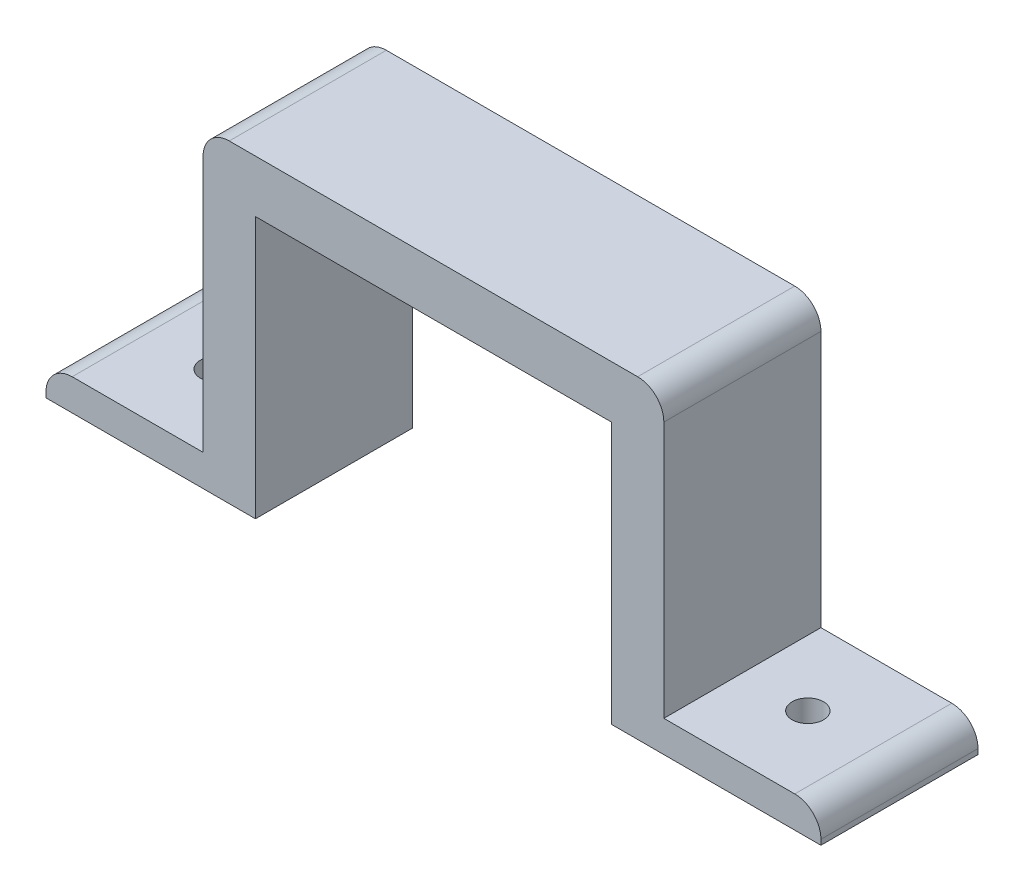
ISO-10303-21;
HEADER;
FILE_DESCRIPTION(('STEP AP214'),'2;1');
FILE_NAME('part.step','',(''),(''),'','','');
FILE_SCHEMA(('AUTOMOTIVE_DESIGN { 1 0 10303 214 1 1 1 1 }'));
ENDSEC;
DATA;
#1=APPLICATION_CONTEXT('core data for automotive mechanical design processes');
#2=APPLICATION_PROTOCOL_DEFINITION('international standard','automotive_design',2000,#1);
#3=PRODUCT_CONTEXT('',#1,'mechanical');
#4=PRODUCT('Part','Part','',(#3));
#5=PRODUCT_RELATED_PRODUCT_CATEGORY('part','',(#4));
#6=PRODUCT_DEFINITION_FORMATION('','',#4);
#7=PRODUCT_DEFINITION_CONTEXT('part definition',#1,'design');
#8=PRODUCT_DEFINITION('design','',#6,#7);
#9=PRODUCT_DEFINITION_SHAPE('','',#8);
#10=(LENGTH_UNIT() NAMED_UNIT(*) SI_UNIT(.MILLI.,.METRE.));
#11=(NAMED_UNIT(*) PLANE_ANGLE_UNIT() SI_UNIT($,.RADIAN.));
#12=(NAMED_UNIT(*) SI_UNIT($,.STERADIAN.) SOLID_ANGLE_UNIT());
#13=UNCERTAINTY_MEASURE_WITH_UNIT(LENGTH_MEASURE(1.E-05),#10,'distance_accuracy_value','');
#14=(GEOMETRIC_REPRESENTATION_CONTEXT(3) GLOBAL_UNCERTAINTY_ASSIGNED_CONTEXT((#13)) GLOBAL_UNIT_ASSIGNED_CONTEXT((#10,
#11,#12)) REPRESENTATION_CONTEXT('',''));
#15=CARTESIAN_POINT('',(0.,0.,0.));
#16=DIRECTION('',(0.,0.,1.));
#17=DIRECTION('',(1.,0.,0.));
#18=AXIS2_PLACEMENT_3D('',#15,#16,#17);
#19=CARTESIAN_POINT('',(-17.,0.,15.));
#20=DIRECTION('',(0.,1.,0.));
#21=DIRECTION('',(-1.,0.,0.));
#22=AXIS2_PLACEMENT_3D('',#19,#20,#21);
#23=PLANE('',#22);
#24=CARTESIAN_POINT('',(-28.25,0.,7.5));
#25=DIRECTION('',(0.,1.,0.));
#26=DIRECTION('',(-1.,0.,0.));
#27=AXIS2_PLACEMENT_3D('',#24,#25,#26);
#28=CIRCLE('',#27,1.5);
#29=CARTESIAN_POINT('',(-28.25,0.,9.));
#30=VERTEX_POINT('',#29);
#31=EDGE_CURVE('E314',#30,#30,#28,.F.);
#32=ORIENTED_EDGE('',*,*,#31,.F.);
#33=EDGE_LOOP('',(#32));
#34=FACE_BOUND('',#33,.T.);
#35=DIRECTION('',(1.,0.,0.));
#36=VECTOR('',#35,1.);
#37=CARTESIAN_POINT('',(-17.,0.,0.));
#38=LINE('',#37,#36);
#39=CARTESIAN_POINT('',(-37.,0.,0.));
#40=VERTEX_POINT('',#39);
#41=CARTESIAN_POINT('',(-17.,0.,0.));
#42=VERTEX_POINT('',#41);
#43=EDGE_CURVE('E179',#40,#42,#38,.T.);
#44=ORIENTED_EDGE('',*,*,#43,.T.);
#45=DIRECTION('',(0.,0.,-1.));
#46=VECTOR('',#45,1.);
#47=CARTESIAN_POINT('',(-17.,0.,15.));
#48=LINE('',#47,#46);
#49=CARTESIAN_POINT('',(-17.,0.,15.));
#50=VERTEX_POINT('',#49);
#51=EDGE_CURVE('E158',#50,#42,#48,.T.);
#52=ORIENTED_EDGE('',*,*,#51,.F.);
#53=DIRECTION('',(1.,0.,0.));
#54=VECTOR('',#53,1.);
#55=CARTESIAN_POINT('',(-17.,0.,15.));
#56=LINE('',#55,#54);
#57=CARTESIAN_POINT('',(-37.,0.,15.));
#58=VERTEX_POINT('',#57);
#59=EDGE_CURVE('E165',#58,#50,#56,.T.);
#60=ORIENTED_EDGE('',*,*,#59,.F.);
#61=DIRECTION('',(0.,0.,-1.));
#62=VECTOR('',#61,1.);
#63=CARTESIAN_POINT('',(-37.,0.,15.));
#64=LINE('',#63,#62);
#65=EDGE_CURVE('E272',#58,#40,#64,.T.);
#66=ORIENTED_EDGE('',*,*,#65,.T.);
#67=EDGE_LOOP('',(#44,#52,#60,#66));
#68=FACE_BOUND('',#67,.T.);
#69=ADVANCED_FACE('F39',(#34,#68),#23,.F.);
#70=CARTESIAN_POINT('',(-17.,25.,15.));
#71=DIRECTION('',(-1.,0.,0.));
#72=DIRECTION('',(0.,0.,1.));
#73=AXIS2_PLACEMENT_3D('',#70,#71,#72);
#74=PLANE('',#73);
#75=DIRECTION('',(0.,1.,0.));
#76=VECTOR('',#75,1.);
#77=CARTESIAN_POINT('',(-17.,25.,0.));
#78=LINE('',#77,#76);
#79=CARTESIAN_POINT('',(-17.,25.,0.));
#80=VERTEX_POINT('',#79);
#81=EDGE_CURVE('E307',#42,#80,#78,.T.);
#82=ORIENTED_EDGE('',*,*,#81,.T.);
#83=DIRECTION('',(0.,0.,-1.));
#84=VECTOR('',#83,1.);
#85=CARTESIAN_POINT('',(-17.,25.,15.));
#86=LINE('',#85,#84);
#87=CARTESIAN_POINT('',(-17.,25.,15.));
#88=VERTEX_POINT('',#87);
#89=EDGE_CURVE('E161',#88,#80,#86,.T.);
#90=ORIENTED_EDGE('',*,*,#89,.F.);
#91=DIRECTION('',(0.,1.,0.));
#92=VECTOR('',#91,1.);
#93=CARTESIAN_POINT('',(-17.,25.,15.));
#94=LINE('',#93,#92);
#95=EDGE_CURVE('E154',#50,#88,#94,.T.);
#96=ORIENTED_EDGE('',*,*,#95,.F.);
#97=ORIENTED_EDGE('',*,*,#51,.T.);
#98=EDGE_LOOP('',(#82,#90,#96,#97));
#99=FACE_BOUND('',#98,.T.);
#100=ADVANCED_FACE('F156',(#99),#74,.F.);
#101=CARTESIAN_POINT('',(17.,25.,15.));
#102=DIRECTION('',(0.,1.,0.));
#103=DIRECTION('',(0.,0.,1.));
#104=AXIS2_PLACEMENT_3D('',#101,#102,#103);
#105=PLANE('',#104);
#106=DIRECTION('',(1.,0.,0.));
#107=VECTOR('',#106,1.);
#108=CARTESIAN_POINT('',(17.,25.,0.));
#109=LINE('',#108,#107);
#110=CARTESIAN_POINT('',(17.,25.,0.));
#111=VERTEX_POINT('',#110);
#112=EDGE_CURVE('E302',#80,#111,#109,.T.);
#113=ORIENTED_EDGE('',*,*,#112,.T.);
#114=DIRECTION('',(0.,0.,-1.));
#115=VECTOR('',#114,1.);
#116=CARTESIAN_POINT('',(17.,25.,15.));
#117=LINE('',#116,#115);
#118=CARTESIAN_POINT('',(17.,25.,15.));
#119=VERTEX_POINT('',#118);
#120=EDGE_CURVE('E188',#119,#111,#117,.T.);
#121=ORIENTED_EDGE('',*,*,#120,.F.);
#122=DIRECTION('',(1.,0.,0.));
#123=VECTOR('',#122,1.);
#124=CARTESIAN_POINT('',(17.,25.,15.));
#125=LINE('',#124,#123);
#126=EDGE_CURVE('E164',#88,#119,#125,.T.);
#127=ORIENTED_EDGE('',*,*,#126,.F.);
#128=ORIENTED_EDGE('',*,*,#89,.T.);
#129=EDGE_LOOP('',(#113,#121,#127,#128));
#130=FACE_BOUND('',#129,.T.);
#131=ADVANCED_FACE('F377',(#130),#105,.F.);
#132=CARTESIAN_POINT('',(17.,25.,15.));
#133=DIRECTION('',(1.,0.,0.));
#134=DIRECTION('',(0.,0.,-1.));
#135=AXIS2_PLACEMENT_3D('',#132,#133,#134);
#136=PLANE('',#135);
#137=DIRECTION('',(0.,-1.,0.));
#138=VECTOR('',#137,1.);
#139=CARTESIAN_POINT('',(17.,25.,0.));
#140=LINE('',#139,#138);
#141=CARTESIAN_POINT('',(17.,0.,0.));
#142=VERTEX_POINT('',#141);
#143=EDGE_CURVE('E297',#111,#142,#140,.T.);
#144=ORIENTED_EDGE('',*,*,#143,.T.);
#145=DIRECTION('',(0.,0.,-1.));
#146=VECTOR('',#145,1.);
#147=CARTESIAN_POINT('',(17.,0.,15.));
#148=LINE('',#147,#146);
#149=CARTESIAN_POINT('',(17.,0.,15.));
#150=VERTEX_POINT('',#149);
#151=EDGE_CURVE('E286',#150,#142,#148,.T.);
#152=ORIENTED_EDGE('',*,*,#151,.F.);
#153=DIRECTION('',(0.,-1.,0.));
#154=VECTOR('',#153,1.);
#155=CARTESIAN_POINT('',(17.,25.,15.));
#156=LINE('',#155,#154);
#157=EDGE_CURVE('E298',#119,#150,#156,.T.);
#158=ORIENTED_EDGE('',*,*,#157,.F.);
#159=ORIENTED_EDGE('',*,*,#120,.T.);
#160=EDGE_LOOP('',(#144,#152,#158,#159));
#161=FACE_BOUND('',#160,.T.);
#162=ADVANCED_FACE('F295',(#161),#136,.F.);
#163=CARTESIAN_POINT('',(17.,0.,15.));
#164=DIRECTION('',(0.,1.,0.));
#165=DIRECTION('',(-1.,0.,0.));
#166=AXIS2_PLACEMENT_3D('',#163,#164,#165);
#167=PLANE('',#166);
#168=CARTESIAN_POINT('',(28.25,0.,7.49999999999999));
#169=DIRECTION('',(0.,1.,0.));
#170=DIRECTION('',(-1.,0.,0.));
#171=AXIS2_PLACEMENT_3D('',#168,#169,#170);
#172=CIRCLE('',#171,1.5);
#173=CARTESIAN_POINT('',(28.25,0.,8.99999999999999));
#174=VERTEX_POINT('',#173);
#175=EDGE_CURVE('E343',#174,#174,#172,.F.);
#176=ORIENTED_EDGE('',*,*,#175,.F.);
#177=EDGE_LOOP('',(#176));
#178=FACE_BOUND('',#177,.T.);
#179=DIRECTION('',(1.,0.,0.));
#180=VECTOR('',#179,1.);
#181=CARTESIAN_POINT('',(17.,0.,0.));
#182=LINE('',#181,#180);
#183=CARTESIAN_POINT('',(37.,0.,0.));
#184=VERTEX_POINT('',#183);
#185=EDGE_CURVE('E257',#142,#184,#182,.T.);
#186=ORIENTED_EDGE('',*,*,#185,.T.);
#187=DIRECTION('',(0.,0.,-1.));
#188=VECTOR('',#187,1.);
#189=CARTESIAN_POINT('',(37.,0.,15.));
#190=LINE('',#189,#188);
#191=CARTESIAN_POINT('',(37.,0.,15.));
#192=VERTEX_POINT('',#191);
#193=EDGE_CURVE('E282',#192,#184,#190,.T.);
#194=ORIENTED_EDGE('',*,*,#193,.F.);
#195=DIRECTION('',(1.,0.,0.));
#196=VECTOR('',#195,1.);
#197=CARTESIAN_POINT('',(17.,0.,15.));
#198=LINE('',#197,#196);
#199=EDGE_CURVE('E336',#150,#192,#198,.T.);
#200=ORIENTED_EDGE('',*,*,#199,.F.);
#201=ORIENTED_EDGE('',*,*,#151,.T.);
#202=EDGE_LOOP('',(#186,#194,#200,#201));
#203=FACE_BOUND('',#202,.T.);
#204=ADVANCED_FACE('F381',(#178,#203),#167,.F.);
#205=CARTESIAN_POINT('',(37.,0.,15.));
#206=DIRECTION('',(-1.,0.,0.));
#207=DIRECTION('',(0.,0.,1.));
#208=AXIS2_PLACEMENT_3D('',#205,#206,#207);
#209=PLANE('',#208);
#210=DIRECTION('',(0.,1.,0.));
#211=VECTOR('',#210,1.);
#212=CARTESIAN_POINT('',(37.,0.,0.));
#213=LINE('',#212,#211);
#214=CARTESIAN_POINT('',(37.,0.5,0.));
#215=VERTEX_POINT('',#214);
#216=EDGE_CURVE('E251',#184,#215,#213,.T.);
#217=ORIENTED_EDGE('',*,*,#216,.T.);
#218=DIRECTION('',(0.,0.,-1.));
#219=VECTOR('',#218,1.);
#220=CARTESIAN_POINT('',(37.,0.5,15.));
#221=LINE('',#220,#219);
#222=CARTESIAN_POINT('',(37.,0.5,15.));
#223=VERTEX_POINT('',#222);
#224=EDGE_CURVE('E11',#215,#223,#221,.F.);
#225=ORIENTED_EDGE('',*,*,#224,.T.);
#226=DIRECTION('',(0.,1.,0.));
#227=VECTOR('',#226,1.);
#228=CARTESIAN_POINT('',(37.,0.,15.));
#229=LINE('',#228,#227);
#230=EDGE_CURVE('E332',#192,#223,#229,.T.);
#231=ORIENTED_EDGE('',*,*,#230,.F.);
#232=ORIENTED_EDGE('',*,*,#193,.T.);
#233=EDGE_LOOP('',(#217,#225,#231,#232));
#234=FACE_BOUND('',#233,.T.);
#235=ADVANCED_FACE('F384',(#234),#209,.F.);
#236=CARTESIAN_POINT('',(37.,3.,15.));
#237=DIRECTION('',(0.,-1.,0.));
#238=DIRECTION('',(0.,0.,-1.));
#239=AXIS2_PLACEMENT_3D('',#236,#237,#238);
#240=PLANE('',#239);
#241=CARTESIAN_POINT('',(28.25,3.,7.49999999999999));
#242=DIRECTION('',(0.,1.,0.));
#243=DIRECTION('',(0.,0.,-1.));
#244=AXIS2_PLACEMENT_3D('',#241,#242,#243);
#245=CIRCLE('',#244,1.5);
#246=CARTESIAN_POINT('',(28.25,3.,8.99999999999999));
#247=VERTEX_POINT('',#246);
#248=EDGE_CURVE('E348',#247,#247,#245,.T.);
#249=ORIENTED_EDGE('',*,*,#248,.F.);
#250=EDGE_LOOP('',(#249));
#251=FACE_BOUND('',#250,.T.);
#252=DIRECTION('',(-1.,0.,0.));
#253=VECTOR('',#252,1.);
#254=CARTESIAN_POINT('',(37.,3.,15.));
#255=LINE('',#254,#253);
#256=CARTESIAN_POINT('',(34.5,3.,15.));
#257=VERTEX_POINT('',#256);
#258=CARTESIAN_POINT('',(22.,3.,15.));
#259=VERTEX_POINT('',#258);
#260=EDGE_CURVE('E239',#257,#259,#255,.T.);
#261=ORIENTED_EDGE('',*,*,#260,.F.);
#262=DIRECTION('',(0.,0.,-1.));
#263=VECTOR('',#262,1.);
#264=CARTESIAN_POINT('',(34.5,3.,15.));
#265=LINE('',#264,#263);
#266=CARTESIAN_POINT('',(34.5,3.,0.));
#267=VERTEX_POINT('',#266);
#268=EDGE_CURVE('E48',#257,#267,#265,.T.);
#269=ORIENTED_EDGE('',*,*,#268,.T.);
#270=DIRECTION('',(-1.,0.,0.));
#271=VECTOR('',#270,1.);
#272=CARTESIAN_POINT('',(37.,3.,0.));
#273=LINE('',#272,#271);
#274=CARTESIAN_POINT('',(22.,3.,0.));
#275=VERTEX_POINT('',#274);
#276=EDGE_CURVE('E237',#267,#275,#273,.T.);
#277=ORIENTED_EDGE('',*,*,#276,.T.);
#278=DIRECTION('',(0.,0.,-1.));
#279=VECTOR('',#278,1.);
#280=CARTESIAN_POINT('',(22.,3.,15.));
#281=LINE('',#280,#279);
#282=EDGE_CURVE('E279',#259,#275,#281,.T.);
#283=ORIENTED_EDGE('',*,*,#282,.F.);
#284=EDGE_LOOP('',(#261,#269,#277,#283));
#285=FACE_BOUND('',#284,.T.);
#286=ADVANCED_FACE('F235',(#251,#285),#240,.F.);
#287=CARTESIAN_POINT('',(22.,3.,15.));
#288=DIRECTION('',(-1.,0.,0.));
#289=DIRECTION('',(0.,0.,1.));
#290=AXIS2_PLACEMENT_3D('',#287,#288,#289);
#291=PLANE('',#290);
#292=DIRECTION('',(0.,1.,0.));
#293=VECTOR('',#292,1.);
#294=CARTESIAN_POINT('',(22.,3.,0.));
#295=LINE('',#294,#293);
#296=CARTESIAN_POINT('',(22.,27.5,0.));
#297=VERTEX_POINT('',#296);
#298=EDGE_CURVE('E249',#275,#297,#295,.T.);
#299=ORIENTED_EDGE('',*,*,#298,.T.);
#300=DIRECTION('',(0.,0.,-1.));
#301=VECTOR('',#300,1.);
#302=CARTESIAN_POINT('',(22.,27.5,15.));
#303=LINE('',#302,#301);
#304=CARTESIAN_POINT('',(22.,27.5,15.));
#305=VERTEX_POINT('',#304);
#306=EDGE_CURVE('E227',#297,#305,#303,.F.);
#307=ORIENTED_EDGE('',*,*,#306,.T.);
#308=DIRECTION('',(0.,1.,0.));
#309=VECTOR('',#308,1.);
#310=CARTESIAN_POINT('',(22.,3.,15.));
#311=LINE('',#310,#309);
#312=EDGE_CURVE('E326',#259,#305,#311,.T.);
#313=ORIENTED_EDGE('',*,*,#312,.F.);
#314=ORIENTED_EDGE('',*,*,#282,.T.);
#315=EDGE_LOOP('',(#299,#307,#313,#314));
#316=FACE_BOUND('',#315,.T.);
#317=ADVANCED_FACE('F421',(#316),#291,.F.);
#318=CARTESIAN_POINT('',(-22.,30.,15.));
#319=DIRECTION('',(0.,-1.,0.));
#320=DIRECTION('',(0.,0.,-1.));
#321=AXIS2_PLACEMENT_3D('',#318,#319,#320);
#322=PLANE('',#321);
#323=DIRECTION('',(-1.,0.,0.));
#324=VECTOR('',#323,1.);
#325=CARTESIAN_POINT('',(-22.,30.,0.));
#326=LINE('',#325,#324);
#327=CARTESIAN_POINT('',(19.5,30.,0.));
#328=VERTEX_POINT('',#327);
#329=CARTESIAN_POINT('',(-19.5,30.,0.));
#330=VERTEX_POINT('',#329);
#331=EDGE_CURVE('E255',#328,#330,#326,.T.);
#332=ORIENTED_EDGE('',*,*,#331,.T.);
#333=DIRECTION('',(0.,0.,-1.));
#334=VECTOR('',#333,1.);
#335=CARTESIAN_POINT('',(-19.5,30.,15.));
#336=LINE('',#335,#334);
#337=CARTESIAN_POINT('',(-19.5,30.,15.));
#338=VERTEX_POINT('',#337);
#339=EDGE_CURVE('E63',#330,#338,#336,.F.);
#340=ORIENTED_EDGE('',*,*,#339,.T.);
#341=DIRECTION('',(-1.,0.,0.));
#342=VECTOR('',#341,1.);
#343=CARTESIAN_POINT('',(-22.,30.,15.));
#344=LINE('',#343,#342);
#345=CARTESIAN_POINT('',(19.5,30.,15.));
#346=VERTEX_POINT('',#345);
#347=EDGE_CURVE('E323',#346,#338,#344,.T.);
#348=ORIENTED_EDGE('',*,*,#347,.F.);
#349=DIRECTION('',(0.,0.,-1.));
#350=VECTOR('',#349,1.);
#351=CARTESIAN_POINT('',(19.5,30.,15.));
#352=LINE('',#351,#350);
#353=EDGE_CURVE('E221',#346,#328,#352,.T.);
#354=ORIENTED_EDGE('',*,*,#353,.T.);
#355=EDGE_LOOP('',(#332,#340,#348,#354));
#356=FACE_BOUND('',#355,.T.);
#357=ADVANCED_FACE('F416',(#356),#322,.F.);
#358=CARTESIAN_POINT('',(-22.,3.,15.));
#359=DIRECTION('',(1.,0.,0.));
#360=DIRECTION('',(0.,0.,-1.));
#361=AXIS2_PLACEMENT_3D('',#358,#359,#360);
#362=PLANE('',#361);
#363=DIRECTION('',(0.,-1.,0.));
#364=VECTOR('',#363,1.);
#365=CARTESIAN_POINT('',(-22.,3.,15.));
#366=LINE('',#365,#364);
#367=CARTESIAN_POINT('',(-22.,27.5,15.));
#368=VERTEX_POINT('',#367);
#369=CARTESIAN_POINT('',(-22.,3.,15.));
#370=VERTEX_POINT('',#369);
#371=EDGE_CURVE('E320',#368,#370,#366,.T.);
#372=ORIENTED_EDGE('',*,*,#371,.F.);
#373=DIRECTION('',(0.,0.,-1.));
#374=VECTOR('',#373,1.);
#375=CARTESIAN_POINT('',(-22.,27.5,15.));
#376=LINE('',#375,#374);
#377=CARTESIAN_POINT('',(-22.,27.5,0.));
#378=VERTEX_POINT('',#377);
#379=EDGE_CURVE('E217',#368,#378,#376,.T.);
#380=ORIENTED_EDGE('',*,*,#379,.T.);
#381=DIRECTION('',(0.,-1.,0.));
#382=VECTOR('',#381,1.);
#383=CARTESIAN_POINT('',(-22.,3.,0.));
#384=LINE('',#383,#382);
#385=CARTESIAN_POINT('',(-22.,3.,0.));
#386=VERTEX_POINT('',#385);
#387=EDGE_CURVE('E263',#378,#386,#384,.T.);
#388=ORIENTED_EDGE('',*,*,#387,.T.);
#389=DIRECTION('',(0.,0.,-1.));
#390=VECTOR('',#389,1.);
#391=CARTESIAN_POINT('',(-22.,3.,15.));
#392=LINE('',#391,#390);
#393=EDGE_CURVE('E275',#370,#386,#392,.T.);
#394=ORIENTED_EDGE('',*,*,#393,.F.);
#395=EDGE_LOOP('',(#372,#380,#388,#394));
#396=FACE_BOUND('',#395,.T.);
#397=ADVANCED_FACE('F365',(#396),#362,.F.);
#398=CARTESIAN_POINT('',(-37.,3.,15.));
#399=DIRECTION('',(0.,-1.,0.));
#400=DIRECTION('',(0.,0.,-1.));
#401=AXIS2_PLACEMENT_3D('',#398,#399,#400);
#402=PLANE('',#401);
#403=CARTESIAN_POINT('',(-28.25,3.,7.5));
#404=DIRECTION('',(0.,1.,0.));
#405=DIRECTION('',(0.,0.,1.));
#406=AXIS2_PLACEMENT_3D('',#403,#404,#405);
#407=CIRCLE('',#406,1.5);
#408=CARTESIAN_POINT('',(-28.25,3.,9.));
#409=VERTEX_POINT('',#408);
#410=EDGE_CURVE('E347',#409,#409,#407,.T.);
#411=ORIENTED_EDGE('',*,*,#410,.F.);
#412=EDGE_LOOP('',(#411));
#413=FACE_BOUND('',#412,.T.);
#414=DIRECTION('',(-1.,0.,0.));
#415=VECTOR('',#414,1.);
#416=CARTESIAN_POINT('',(-37.,3.,0.));
#417=LINE('',#416,#415);
#418=CARTESIAN_POINT('',(-34.5,3.,0.));
#419=VERTEX_POINT('',#418);
#420=EDGE_CURVE('E266',#386,#419,#417,.T.);
#421=ORIENTED_EDGE('',*,*,#420,.T.);
#422=DIRECTION('',(0.,0.,-1.));
#423=VECTOR('',#422,1.);
#424=CARTESIAN_POINT('',(-34.5,3.,15.));
#425=LINE('',#424,#423);
#426=CARTESIAN_POINT('',(-34.5,3.,15.));
#427=VERTEX_POINT('',#426);
#428=EDGE_CURVE('E203',#419,#427,#425,.F.);
#429=ORIENTED_EDGE('',*,*,#428,.T.);
#430=DIRECTION('',(-1.,0.,0.));
#431=VECTOR('',#430,1.);
#432=CARTESIAN_POINT('',(-37.,3.,15.));
#433=LINE('',#432,#431);
#434=EDGE_CURVE('E317',#370,#427,#433,.T.);
#435=ORIENTED_EDGE('',*,*,#434,.F.);
#436=ORIENTED_EDGE('',*,*,#393,.T.);
#437=EDGE_LOOP('',(#421,#429,#435,#436));
#438=FACE_BOUND('',#437,.T.);
#439=ADVANCED_FACE('F361',(#413,#438),#402,.F.);
#440=CARTESIAN_POINT('',(-37.,0.,15.));
#441=DIRECTION('',(1.,0.,0.));
#442=DIRECTION('',(0.,0.,-1.));
#443=AXIS2_PLACEMENT_3D('',#440,#441,#442);
#444=PLANE('',#443);
#445=DIRECTION('',(0.,-1.,0.));
#446=VECTOR('',#445,1.);
#447=CARTESIAN_POINT('',(-37.,0.,15.));
#448=LINE('',#447,#446);
#449=CARTESIAN_POINT('',(-37.,0.5,15.));
#450=VERTEX_POINT('',#449);
#451=EDGE_CURVE('E171',#450,#58,#448,.T.);
#452=ORIENTED_EDGE('',*,*,#451,.F.);
#453=DIRECTION('',(0.,0.,-1.));
#454=VECTOR('',#453,1.);
#455=CARTESIAN_POINT('',(-37.,0.5,15.));
#456=LINE('',#455,#454);
#457=CARTESIAN_POINT('',(-37.,0.5,0.));
#458=VERTEX_POINT('',#457);
#459=EDGE_CURVE('E181',#450,#458,#456,.T.);
#460=ORIENTED_EDGE('',*,*,#459,.T.);
#461=DIRECTION('',(0.,-1.,0.));
#462=VECTOR('',#461,1.);
#463=CARTESIAN_POINT('',(-37.,0.,0.));
#464=LINE('',#463,#462);
#465=EDGE_CURVE('E176',#458,#40,#464,.T.);
#466=ORIENTED_EDGE('',*,*,#465,.T.);
#467=ORIENTED_EDGE('',*,*,#65,.F.);
#468=EDGE_LOOP('',(#452,#460,#466,#467));
#469=FACE_BOUND('',#468,.T.);
#470=ADVANCED_FACE('F364',(#469),#444,.F.);
#471=CARTESIAN_POINT('',(0.,0.,15.));
#472=DIRECTION('',(0.,0.,-1.));
#473=DIRECTION('',(-1.,0.,0.));
#474=AXIS2_PLACEMENT_3D('',#471,#472,#473);
#475=PLANE('',#474);
#476=ORIENTED_EDGE('',*,*,#434,.T.);
#477=CARTESIAN_POINT('',(-34.5,0.5,15.));
#478=DIRECTION('',(0.,0.,-1.));
#479=DIRECTION('',(-1.,0.,0.));
#480=AXIS2_PLACEMENT_3D('',#477,#478,#479);
#481=CIRCLE('',#480,2.5);
#482=EDGE_CURVE('E214',#427,#450,#481,.F.);
#483=ORIENTED_EDGE('',*,*,#482,.T.);
#484=ORIENTED_EDGE('',*,*,#451,.T.);
#485=ORIENTED_EDGE('',*,*,#59,.T.);
#486=ORIENTED_EDGE('',*,*,#95,.T.);
#487=ORIENTED_EDGE('',*,*,#126,.T.);
#488=ORIENTED_EDGE('',*,*,#157,.T.);
#489=ORIENTED_EDGE('',*,*,#199,.T.);
#490=ORIENTED_EDGE('',*,*,#230,.T.);
#491=CARTESIAN_POINT('',(34.5,0.5,15.));
#492=DIRECTION('',(0.,0.,-1.));
#493=DIRECTION('',(-1.,0.,0.));
#494=AXIS2_PLACEMENT_3D('',#491,#492,#493);
#495=CIRCLE('',#494,2.5);
#496=EDGE_CURVE('E206',#223,#257,#495,.F.);
#497=ORIENTED_EDGE('',*,*,#496,.T.);
#498=ORIENTED_EDGE('',*,*,#260,.T.);
#499=ORIENTED_EDGE('',*,*,#312,.T.);
#500=CARTESIAN_POINT('',(19.5,27.5,15.));
#501=DIRECTION('',(0.,0.,-1.));
#502=DIRECTION('',(-1.,0.,0.));
#503=AXIS2_PLACEMENT_3D('',#500,#501,#502);
#504=CIRCLE('',#503,2.5);
#505=EDGE_CURVE('E209',#305,#346,#504,.F.);
#506=ORIENTED_EDGE('',*,*,#505,.T.);
#507=ORIENTED_EDGE('',*,*,#347,.T.);
#508=CARTESIAN_POINT('',(-19.5,27.5,15.));
#509=DIRECTION('',(0.,0.,-1.));
#510=DIRECTION('',(-1.,0.,0.));
#511=AXIS2_PLACEMENT_3D('',#508,#509,#510);
#512=CIRCLE('',#511,2.5);
#513=EDGE_CURVE('E55',#338,#368,#512,.F.);
#514=ORIENTED_EDGE('',*,*,#513,.T.);
#515=ORIENTED_EDGE('',*,*,#371,.T.);
#516=EDGE_LOOP('',(#476,#483,#484,#485,#486,#487,#488,#489,#490,#497,#498,#499,#506,#507,#514,#515));
#517=FACE_BOUND('',#516,.T.);
#518=ADVANCED_FACE('F169',(#517),#475,.F.);
#519=CARTESIAN_POINT('',(0.,0.,0.));
#520=DIRECTION('',(0.,0.,-1.));
#521=DIRECTION('',(-1.,0.,0.));
#522=AXIS2_PLACEMENT_3D('',#519,#520,#521);
#523=PLANE('',#522);
#524=ORIENTED_EDGE('',*,*,#465,.F.);
#525=CARTESIAN_POINT('',(-34.5,0.5,0.));
#526=DIRECTION('',(0.,0.,-1.));
#527=DIRECTION('',(-1.,0.,0.));
#528=AXIS2_PLACEMENT_3D('',#525,#526,#527);
#529=CIRCLE('',#528,2.5);
#530=EDGE_CURVE('E200',#458,#419,#529,.T.);
#531=ORIENTED_EDGE('',*,*,#530,.T.);
#532=ORIENTED_EDGE('',*,*,#420,.F.);
#533=ORIENTED_EDGE('',*,*,#387,.F.);
#534=CARTESIAN_POINT('',(-19.5,27.5,0.));
#535=DIRECTION('',(0.,0.,-1.));
#536=DIRECTION('',(-1.,0.,0.));
#537=AXIS2_PLACEMENT_3D('',#534,#535,#536);
#538=CIRCLE('',#537,2.5);
#539=EDGE_CURVE('E197',#378,#330,#538,.T.);
#540=ORIENTED_EDGE('',*,*,#539,.T.);
#541=ORIENTED_EDGE('',*,*,#331,.F.);
#542=CARTESIAN_POINT('',(19.5,27.5,0.));
#543=DIRECTION('',(0.,0.,-1.));
#544=DIRECTION('',(-1.,0.,0.));
#545=AXIS2_PLACEMENT_3D('',#542,#543,#544);
#546=CIRCLE('',#545,2.5);
#547=EDGE_CURVE('E194',#328,#297,#546,.T.);
#548=ORIENTED_EDGE('',*,*,#547,.T.);
#549=ORIENTED_EDGE('',*,*,#298,.F.);
#550=ORIENTED_EDGE('',*,*,#276,.F.);
#551=CARTESIAN_POINT('',(34.5,0.5,0.));
#552=DIRECTION('',(0.,0.,-1.));
#553=DIRECTION('',(-1.,0.,0.));
#554=AXIS2_PLACEMENT_3D('',#551,#552,#553);
#555=CIRCLE('',#554,2.5);
#556=EDGE_CURVE('E186',#267,#215,#555,.T.);
#557=ORIENTED_EDGE('',*,*,#556,.T.);
#558=ORIENTED_EDGE('',*,*,#216,.F.);
#559=ORIENTED_EDGE('',*,*,#185,.F.);
#560=ORIENTED_EDGE('',*,*,#143,.F.);
#561=ORIENTED_EDGE('',*,*,#112,.F.);
#562=ORIENTED_EDGE('',*,*,#81,.F.);
#563=ORIENTED_EDGE('',*,*,#43,.F.);
#564=EDGE_LOOP('',(#524,#531,#532,#533,#540,#541,#548,#549,#550,#557,#558,#559,#560,#561,#562,#563));
#565=FACE_BOUND('',#564,.T.);
#566=ADVANCED_FACE('F245',(#565),#523,.T.);
#567=CARTESIAN_POINT('',(-34.5,0.5,15.));
#568=DIRECTION('',(0.,0.,-1.));
#569=DIRECTION('',(-1.,0.,0.));
#570=AXIS2_PLACEMENT_3D('',#567,#568,#569);
#571=CYLINDRICAL_SURFACE('',#570,2.5);
#572=ORIENTED_EDGE('',*,*,#482,.F.);
#573=ORIENTED_EDGE('',*,*,#428,.F.);
#574=ORIENTED_EDGE('',*,*,#530,.F.);
#575=ORIENTED_EDGE('',*,*,#459,.F.);
#576=EDGE_LOOP('',(#572,#573,#574,#575));
#577=FACE_BOUND('',#576,.T.);
#578=ADVANCED_FACE('F374',(#577),#571,.T.);
#579=CARTESIAN_POINT('',(-19.5,27.5,15.));
#580=DIRECTION('',(0.,0.,-1.));
#581=DIRECTION('',(-1.,0.,0.));
#582=AXIS2_PLACEMENT_3D('',#579,#580,#581);
#583=CYLINDRICAL_SURFACE('',#582,2.5);
#584=ORIENTED_EDGE('',*,*,#513,.F.);
#585=ORIENTED_EDGE('',*,*,#339,.F.);
#586=ORIENTED_EDGE('',*,*,#539,.F.);
#587=ORIENTED_EDGE('',*,*,#379,.F.);
#588=EDGE_LOOP('',(#584,#585,#586,#587));
#589=FACE_BOUND('',#588,.T.);
#590=ADVANCED_FACE('F395',(#589),#583,.T.);
#591=CARTESIAN_POINT('',(19.5,27.5,15.));
#592=DIRECTION('',(0.,0.,-1.));
#593=DIRECTION('',(-1.,0.,0.));
#594=AXIS2_PLACEMENT_3D('',#591,#592,#593);
#595=CYLINDRICAL_SURFACE('',#594,2.5);
#596=ORIENTED_EDGE('',*,*,#505,.F.);
#597=ORIENTED_EDGE('',*,*,#306,.F.);
#598=ORIENTED_EDGE('',*,*,#547,.F.);
#599=ORIENTED_EDGE('',*,*,#353,.F.);
#600=EDGE_LOOP('',(#596,#597,#598,#599));
#601=FACE_BOUND('',#600,.T.);
#602=ADVANCED_FACE('F387',(#601),#595,.T.);
#603=CARTESIAN_POINT('',(34.5,0.5,15.));
#604=DIRECTION('',(0.,0.,-1.));
#605=DIRECTION('',(-1.,0.,0.));
#606=AXIS2_PLACEMENT_3D('',#603,#604,#605);
#607=CYLINDRICAL_SURFACE('',#606,2.5);
#608=ORIENTED_EDGE('',*,*,#496,.F.);
#609=ORIENTED_EDGE('',*,*,#224,.F.);
#610=ORIENTED_EDGE('',*,*,#556,.F.);
#611=ORIENTED_EDGE('',*,*,#268,.F.);
#612=EDGE_LOOP('',(#608,#609,#610,#611));
#613=FACE_BOUND('',#612,.T.);
#614=ADVANCED_FACE('F41',(#613),#607,.T.);
#615=CARTESIAN_POINT('',(-28.25,-4.24264068711929,7.5));
#616=DIRECTION('',(0.,1.,0.));
#617=DIRECTION('',(0.,0.,1.));
#618=AXIS2_PLACEMENT_3D('',#615,#616,#617);
#619=CYLINDRICAL_SURFACE('',#618,1.5);
#620=CARTESIAN_POINT('',(-28.25,0.,9.));
#621=CARTESIAN_POINT('',(-28.25,0.0312499999999983,9.));
#622=CARTESIAN_POINT('',(-28.25,0.0624999999999983,9.));
#623=CARTESIAN_POINT('',(-28.25,0.124999999999998,9.));
#624=CARTESIAN_POINT('',(-28.25,0.156249999999998,9.));
#625=CARTESIAN_POINT('',(-28.25,0.218749999999998,9.));
#626=CARTESIAN_POINT('',(-28.25,0.249999999999999,9.));
#627=CARTESIAN_POINT('',(-28.25,0.312499999999999,9.));
#628=CARTESIAN_POINT('',(-28.25,0.343749999999999,9.));
#629=CARTESIAN_POINT('',(-28.25,0.406249999999999,9.));
#630=CARTESIAN_POINT('',(-28.25,0.437499999999999,9.));
#631=CARTESIAN_POINT('',(-28.25,0.499999999999999,9.));
#632=CARTESIAN_POINT('',(-28.25,0.531249999999999,9.));
#633=CARTESIAN_POINT('',(-28.25,0.593749999999999,9.));
#634=CARTESIAN_POINT('',(-28.25,0.624999999999999,9.));
#635=CARTESIAN_POINT('',(-28.25,0.687499999999999,9.));
#636=CARTESIAN_POINT('',(-28.25,0.718749999999999,9.));
#637=CARTESIAN_POINT('',(-28.25,0.781249999999999,9.));
#638=CARTESIAN_POINT('',(-28.25,0.812499999999999,9.));
#639=CARTESIAN_POINT('',(-28.25,0.874999999999999,9.));
#640=CARTESIAN_POINT('',(-28.25,0.906249999999999,9.));
#641=CARTESIAN_POINT('',(-28.25,0.968749999999998,9.));
#642=CARTESIAN_POINT('',(-28.25,0.999999999999998,9.));
#643=CARTESIAN_POINT('',(-28.25,1.0625,9.));
#644=CARTESIAN_POINT('',(-28.25,1.09375,9.));
#645=CARTESIAN_POINT('',(-28.25,1.15625,9.));
#646=CARTESIAN_POINT('',(-28.25,1.1875,9.));
#647=CARTESIAN_POINT('',(-28.25,1.25,9.));
#648=CARTESIAN_POINT('',(-28.25,1.28125,9.));
#649=CARTESIAN_POINT('',(-28.25,1.34375,9.));
#650=CARTESIAN_POINT('',(-28.25,1.375,9.));
#651=CARTESIAN_POINT('',(-28.25,1.4375,9.));
#652=CARTESIAN_POINT('',(-28.25,1.46875,9.));
#653=CARTESIAN_POINT('',(-28.25,1.53125,9.));
#654=CARTESIAN_POINT('',(-28.25,1.5625,9.));
#655=CARTESIAN_POINT('',(-28.25,1.625,9.));
#656=CARTESIAN_POINT('',(-28.25,1.65625,9.));
#657=CARTESIAN_POINT('',(-28.25,1.71875,9.));
#658=CARTESIAN_POINT('',(-28.25,1.75,9.));
#659=CARTESIAN_POINT('',(-28.25,1.8125,9.));
#660=CARTESIAN_POINT('',(-28.25,1.84375,9.));
#661=CARTESIAN_POINT('',(-28.25,1.90625,9.));
#662=CARTESIAN_POINT('',(-28.25,1.9375,9.));
#663=CARTESIAN_POINT('',(-28.25,2.,9.));
#664=CARTESIAN_POINT('',(-28.25,2.03125,9.));
#665=CARTESIAN_POINT('',(-28.25,2.09375,9.));
#666=CARTESIAN_POINT('',(-28.25,2.125,9.));
#667=CARTESIAN_POINT('',(-28.25,2.1875,9.));
#668=CARTESIAN_POINT('',(-28.25,2.21875,9.));
#669=CARTESIAN_POINT('',(-28.25,2.28125,9.));
#670=CARTESIAN_POINT('',(-28.25,2.3125,9.));
#671=CARTESIAN_POINT('',(-28.25,2.375,9.));
#672=CARTESIAN_POINT('',(-28.25,2.40625,9.));
#673=CARTESIAN_POINT('',(-28.25,2.46875,9.));
#674=CARTESIAN_POINT('',(-28.25,2.5,9.));
#675=CARTESIAN_POINT('',(-28.25,2.5625,9.));
#676=CARTESIAN_POINT('',(-28.25,2.59375,9.));
#677=CARTESIAN_POINT('',(-28.25,2.65625,9.));
#678=CARTESIAN_POINT('',(-28.25,2.6875,9.));
#679=CARTESIAN_POINT('',(-28.25,2.75,9.));
#680=CARTESIAN_POINT('',(-28.25,2.78125,9.));
#681=CARTESIAN_POINT('',(-28.25,2.84375,9.));
#682=CARTESIAN_POINT('',(-28.25,2.875,9.));
#683=CARTESIAN_POINT('',(-28.25,2.9375,9.));
#684=CARTESIAN_POINT('',(-28.25,2.96875,9.));
#685=CARTESIAN_POINT('',(-28.25,3.,9.));
#686=B_SPLINE_CURVE_WITH_KNOTS('',3,(#620,#621,#622,#623,#624,#625,#626,#627,#628,#629,#630,
#631,#632,#633,#634,#635,#636,#637,#638,#639,#640,#641,#642,#643,#644,#645,#646,#647,#648,#649,
#650,#651,#652,#653,#654,#655,#656,#657,#658,#659,#660,#661,#662,#663,#664,#665,#666,#667,#668,
#669,#670,#671,#672,#673,#674,#675,#676,#677,#678,#679,#680,#681,#682,#683,#684,#685),
.UNSPECIFIED.,.F.,.F.,(4,2,2,2,2,2,2,2,2,2,2,2,2,2,2,2,2,2,2,2,2,2,2,2,2,2,2,2,2,2,2,2,4),(0.,
0.0937500000000001,0.1875,0.28125,0.375,0.46875,0.5625,0.656250000000001,0.750000000000001,
0.843750000000001,0.9375,1.03125,1.125,1.21875,1.3125,1.40625,1.5,1.59375,1.6875,1.78125,1.875,
1.96875,2.0625,2.15625,2.25,2.34375,2.4375,2.53125,2.625,2.71875,2.8125,2.90625,3.),.UNSPECIFIED.);
#687=EDGE_CURVE('BSEAM359',#30,#409,#686,.T.);
#688=ORIENTED_EDGE('',*,*,#31,.T.);
#689=ORIENTED_EDGE('',*,*,#410,.T.);
#690=ORIENTED_EDGE('',*,*,#687,.T.);
#691=ORIENTED_EDGE('',*,*,#687,.F.);
#692=EDGE_LOOP('',(#688,#690,#689,#691));
#693=FACE_BOUND('',#692,.T.);
#694=ADVANCED_FACE('F359',(#693),#619,.F.);
#695=CARTESIAN_POINT('',(28.25,-4.24264068711929,7.49999999999999));
#696=DIRECTION('',(0.,1.,0.));
#697=DIRECTION('',(0.,0.,1.));
#698=AXIS2_PLACEMENT_3D('',#695,#696,#697);
#699=CYLINDRICAL_SURFACE('',#698,1.5);
#700=CARTESIAN_POINT('',(28.25,0.,8.99999999999999));
#701=CARTESIAN_POINT('',(28.25,0.0312500000000052,8.99999999999999));
#702=CARTESIAN_POINT('',(28.25,0.0625000000000053,8.99999999999999));
#703=CARTESIAN_POINT('',(28.25,0.125000000000005,8.99999999999999));
#704=CARTESIAN_POINT('',(28.25,0.156250000000005,8.99999999999999));
#705=CARTESIAN_POINT('',(28.25,0.218750000000005,8.99999999999999));
#706=CARTESIAN_POINT('',(28.25,0.250000000000005,8.99999999999999));
#707=CARTESIAN_POINT('',(28.25,0.312500000000005,8.99999999999999));
#708=CARTESIAN_POINT('',(28.25,0.343750000000005,8.99999999999999));
#709=CARTESIAN_POINT('',(28.25,0.406250000000004,8.99999999999999));
#710=CARTESIAN_POINT('',(28.25,0.437500000000004,8.99999999999999));
#711=CARTESIAN_POINT('',(28.25,0.500000000000004,8.99999999999999));
#712=CARTESIAN_POINT('',(28.25,0.531250000000004,8.99999999999999));
#713=CARTESIAN_POINT('',(28.25,0.593750000000004,8.99999999999999));
#714=CARTESIAN_POINT('',(28.25,0.625000000000004,8.99999999999999));
#715=CARTESIAN_POINT('',(28.25,0.687500000000004,8.99999999999999));
#716=CARTESIAN_POINT('',(28.25,0.718750000000004,8.99999999999999));
#717=CARTESIAN_POINT('',(28.25,0.781250000000004,8.99999999999999));
#718=CARTESIAN_POINT('',(28.25,0.812500000000004,8.99999999999999));
#719=CARTESIAN_POINT('',(28.25,0.875000000000003,8.99999999999999));
#720=CARTESIAN_POINT('',(28.25,0.906250000000003,8.99999999999999));
#721=CARTESIAN_POINT('',(28.25,0.968750000000003,8.99999999999999));
#722=CARTESIAN_POINT('',(28.25,1.,8.99999999999999));
#723=CARTESIAN_POINT('',(28.25,1.0625,8.99999999999999));
#724=CARTESIAN_POINT('',(28.25,1.09375,8.99999999999999));
#725=CARTESIAN_POINT('',(28.25,1.15625,8.99999999999999));
#726=CARTESIAN_POINT('',(28.25,1.1875,8.99999999999999));
#727=CARTESIAN_POINT('',(28.25,1.25,8.99999999999999));
#728=CARTESIAN_POINT('',(28.25,1.28125,8.99999999999999));
#729=CARTESIAN_POINT('',(28.25,1.34375,8.99999999999999));
#730=CARTESIAN_POINT('',(28.25,1.375,8.99999999999999));
#731=CARTESIAN_POINT('',(28.25,1.4375,8.99999999999999));
#732=CARTESIAN_POINT('',(28.25,1.46875,8.99999999999999));
#733=CARTESIAN_POINT('',(28.25,1.53125,8.99999999999999));
#734=CARTESIAN_POINT('',(28.25,1.5625,8.99999999999999));
#735=CARTESIAN_POINT('',(28.25,1.625,8.99999999999999));
#736=CARTESIAN_POINT('',(28.25,1.65625,8.99999999999999));
#737=CARTESIAN_POINT('',(28.25,1.71875,8.99999999999999));
#738=CARTESIAN_POINT('',(28.25,1.75,8.99999999999999));
#739=CARTESIAN_POINT('',(28.25,1.8125,8.99999999999999));
#740=CARTESIAN_POINT('',(28.25,1.84375,8.99999999999999));
#741=CARTESIAN_POINT('',(28.25,1.90625,8.99999999999999));
#742=CARTESIAN_POINT('',(28.25,1.9375,8.99999999999999));
#743=CARTESIAN_POINT('',(28.25,2.,8.99999999999999));
#744=CARTESIAN_POINT('',(28.25,2.03125,8.99999999999999));
#745=CARTESIAN_POINT('',(28.25,2.09375,8.99999999999999));
#746=CARTESIAN_POINT('',(28.25,2.125,8.99999999999999));
#747=CARTESIAN_POINT('',(28.25,2.1875,8.99999999999999));
#748=CARTESIAN_POINT('',(28.25,2.21875,8.99999999999999));
#749=CARTESIAN_POINT('',(28.25,2.28125,8.99999999999999));
#750=CARTESIAN_POINT('',(28.25,2.3125,8.99999999999999));
#751=CARTESIAN_POINT('',(28.25,2.375,8.99999999999999));
#752=CARTESIAN_POINT('',(28.25,2.40625,8.99999999999999));
#753=CARTESIAN_POINT('',(28.25,2.46875,8.99999999999999));
#754=CARTESIAN_POINT('',(28.25,2.5,8.99999999999999));
#755=CARTESIAN_POINT('',(28.25,2.5625,8.99999999999999));
#756=CARTESIAN_POINT('',(28.25,2.59375,8.99999999999999));
#757=CARTESIAN_POINT('',(28.25,2.65625,8.99999999999999));
#758=CARTESIAN_POINT('',(28.25,2.6875,8.99999999999999));
#759=CARTESIAN_POINT('',(28.25,2.75,8.99999999999999));
#760=CARTESIAN_POINT('',(28.25,2.78125,8.99999999999999));
#761=CARTESIAN_POINT('',(28.25,2.84375,8.99999999999999));
#762=CARTESIAN_POINT('',(28.25,2.875,8.99999999999999));
#763=CARTESIAN_POINT('',(28.25,2.9375,8.99999999999999));
#764=CARTESIAN_POINT('',(28.25,2.96875,8.99999999999999));
#765=CARTESIAN_POINT('',(28.25,3.,8.99999999999999));
#766=B_SPLINE_CURVE_WITH_KNOTS('',3,(#700,#701,#702,#703,#704,#705,#706,#707,#708,#709,#710,
#711,#712,#713,#714,#715,#716,#717,#718,#719,#720,#721,#722,#723,#724,#725,#726,#727,#728,#729,
#730,#731,#732,#733,#734,#735,#736,#737,#738,#739,#740,#741,#742,#743,#744,#745,#746,#747,#748,
#749,#750,#751,#752,#753,#754,#755,#756,#757,#758,#759,#760,#761,#762,#763,#764,#765),
.UNSPECIFIED.,.F.,.F.,(4,2,2,2,2,2,2,2,2,2,2,2,2,2,2,2,2,2,2,2,2,2,2,2,2,2,2,2,2,2,2,2,4),(0.,
0.0937500000000001,0.187499999999999,0.281249999999999,0.374999999999999,0.468749999999999,
0.562499999999999,0.656249999999999,0.749999999999999,0.843749999999998,0.937499999999998,
1.03125,1.125,1.21875,1.3125,1.40625,1.5,1.59375,1.6875,1.78125,1.875,1.96875,2.0625,2.15625,
2.25,2.34375,2.4375,2.53125,2.62499999999999,2.71874999999999,2.81249999999999,2.90624999999999,
2.99999999999999),.UNSPECIFIED.);
#767=EDGE_CURVE('BSEAM392',#174,#247,#766,.T.);
#768=ORIENTED_EDGE('',*,*,#175,.T.);
#769=ORIENTED_EDGE('',*,*,#248,.T.);
#770=ORIENTED_EDGE('',*,*,#767,.T.);
#771=ORIENTED_EDGE('',*,*,#767,.F.);
#772=EDGE_LOOP('',(#768,#770,#769,#771));
#773=FACE_BOUND('',#772,.T.);
#774=ADVANCED_FACE('F392',(#773),#699,.F.);
#775=CLOSED_SHELL('',(#69,#100,#131,#162,#204,#235,#286,#317,#357,#397,#439,#470,#518,#566,#578,
#590,#602,#614,#694,#774));
#776=MANIFOLD_SOLID_BREP('B2',#775);
#777=ADVANCED_BREP_SHAPE_REPRESENTATION('',(#18,#776),#14);
#778=SHAPE_DEFINITION_REPRESENTATION(#9,#777);
ENDSEC;
END-ISO-10303-21;
